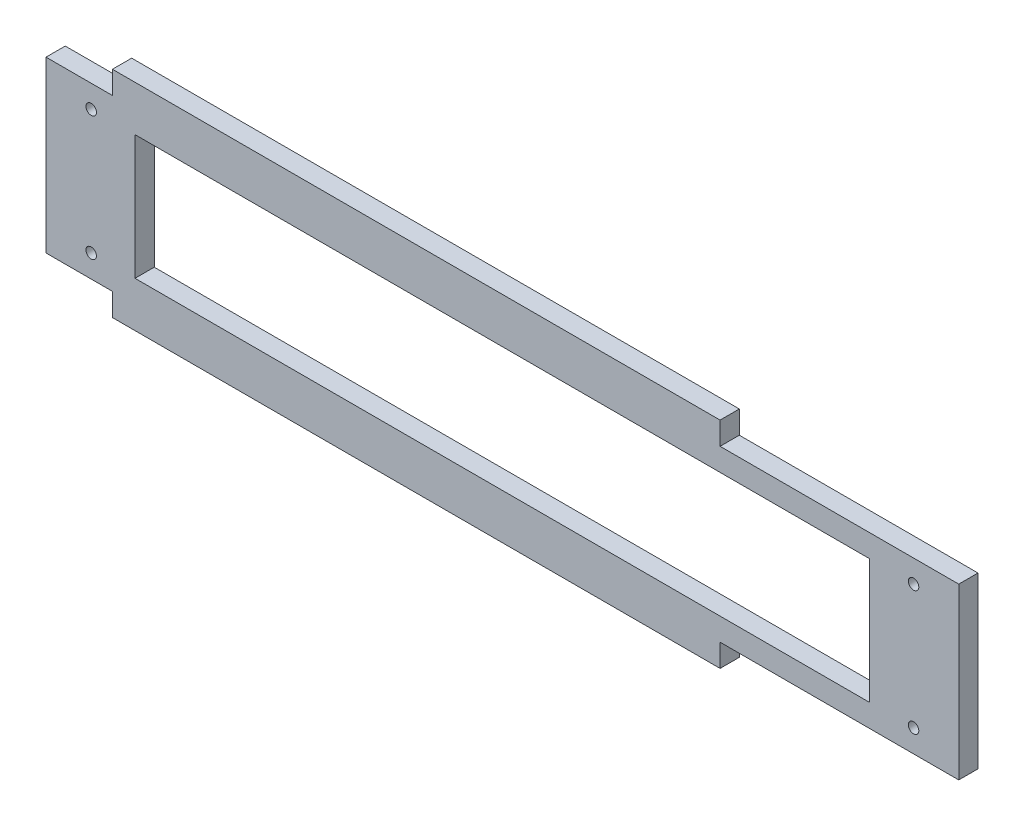
ISO-10303-21;
HEADER;
FILE_DESCRIPTION(('STEP AP214'),'2;1');
FILE_NAME('part.step','',(''),(''),'','','');
FILE_SCHEMA(('AUTOMOTIVE_DESIGN { 1 0 10303 214 1 1 1 1 }'));
ENDSEC;
DATA;
#1=APPLICATION_CONTEXT('core data for automotive mechanical design processes');
#2=APPLICATION_PROTOCOL_DEFINITION('international standard','automotive_design',2000,#1);
#3=PRODUCT_CONTEXT('',#1,'mechanical');
#4=PRODUCT('Part','Part','',(#3));
#5=PRODUCT_RELATED_PRODUCT_CATEGORY('part','',(#4));
#6=PRODUCT_DEFINITION_FORMATION('','',#4);
#7=PRODUCT_DEFINITION_CONTEXT('part definition',#1,'design');
#8=PRODUCT_DEFINITION('design','',#6,#7);
#9=PRODUCT_DEFINITION_SHAPE('','',#8);
#10=(LENGTH_UNIT() NAMED_UNIT(*) SI_UNIT(.MILLI.,.METRE.));
#11=(NAMED_UNIT(*) PLANE_ANGLE_UNIT() SI_UNIT($,.RADIAN.));
#12=(NAMED_UNIT(*) SI_UNIT($,.STERADIAN.) SOLID_ANGLE_UNIT());
#13=UNCERTAINTY_MEASURE_WITH_UNIT(LENGTH_MEASURE(1.E-05),#10,'distance_accuracy_value','');
#14=(GEOMETRIC_REPRESENTATION_CONTEXT(3) GLOBAL_UNCERTAINTY_ASSIGNED_CONTEXT((#13)) GLOBAL_UNIT_ASSIGNED_CONTEXT((#10,
#11,#12)) REPRESENTATION_CONTEXT('',''));
#15=CARTESIAN_POINT('',(0.,0.,0.));
#16=DIRECTION('',(0.,0.,1.));
#17=DIRECTION('',(1.,0.,0.));
#18=AXIS2_PLACEMENT_3D('',#15,#16,#17);
#19=CARTESIAN_POINT('',(-128.27,0.,5.4102));
#20=DIRECTION('',(-1.,0.,0.));
#21=DIRECTION('',(0.,0.,1.));
#22=AXIS2_PLACEMENT_3D('',#19,#20,#21);
#23=PLANE('',#22);
#24=DIRECTION('',(0.,1.,0.));
#25=VECTOR('',#24,1.);
#26=CARTESIAN_POINT('',(-128.27,0.,0.));
#27=LINE('',#26,#25);
#28=CARTESIAN_POINT('',(-128.27,-23.8379,0.));
#29=VERTEX_POINT('',#28);
#30=CARTESIAN_POINT('',(-128.27,23.8379,0.));
#31=VERTEX_POINT('',#30);
#32=EDGE_CURVE('E209',#29,#31,#27,.T.);
#33=ORIENTED_EDGE('',*,*,#32,.F.);
#34=DIRECTION('',(0.,0.,-1.));
#35=VECTOR('',#34,1.);
#36=CARTESIAN_POINT('',(-128.27,-23.8379,5.4102));
#37=LINE('',#36,#35);
#38=CARTESIAN_POINT('',(-128.27,-23.8379,5.4102));
#39=VERTEX_POINT('',#38);
#40=EDGE_CURVE('E11',#39,#29,#37,.T.);
#41=ORIENTED_EDGE('',*,*,#40,.F.);
#42=DIRECTION('',(0.,1.,0.));
#43=VECTOR('',#42,1.);
#44=CARTESIAN_POINT('',(-128.27,0.,5.4102));
#45=LINE('',#44,#43);
#46=CARTESIAN_POINT('',(-128.27,23.8379,5.4102));
#47=VERTEX_POINT('',#46);
#48=EDGE_CURVE('E384',#39,#47,#45,.T.);
#49=ORIENTED_EDGE('',*,*,#48,.T.);
#50=DIRECTION('',(0.,0.,-1.));
#51=VECTOR('',#50,1.);
#52=CARTESIAN_POINT('',(-128.27,23.8379,5.4102));
#53=LINE('',#52,#51);
#54=EDGE_CURVE('E112',#47,#31,#53,.T.);
#55=ORIENTED_EDGE('',*,*,#54,.T.);
#56=EDGE_LOOP('',(#33,#41,#49,#55));
#57=FACE_BOUND('',#56,.T.);
#58=ADVANCED_FACE('F35',(#57),#23,.T.);
#59=CARTESIAN_POINT('',(0.,-23.8379,5.4102));
#60=DIRECTION('',(0.,-1.,0.));
#61=DIRECTION('',(0.,0.,-1.));
#62=AXIS2_PLACEMENT_3D('',#59,#60,#61);
#63=PLANE('',#62);
#64=DIRECTION('',(-1.,0.,0.));
#65=VECTOR('',#64,1.);
#66=CARTESIAN_POINT('',(0.,-23.8379,0.));
#67=LINE('',#66,#65);
#68=CARTESIAN_POINT('',(-109.601,-23.8379,0.));
#69=VERTEX_POINT('',#68);
#70=EDGE_CURVE('E212',#69,#29,#67,.T.);
#71=ORIENTED_EDGE('',*,*,#70,.F.);
#72=DIRECTION('',(0.,0.,-1.));
#73=VECTOR('',#72,1.);
#74=CARTESIAN_POINT('',(-109.601,-23.8379,5.4102));
#75=LINE('',#74,#73);
#76=CARTESIAN_POINT('',(-109.601,-23.8379,5.4102));
#77=VERTEX_POINT('',#76);
#78=EDGE_CURVE('E45',#77,#69,#75,.T.);
#79=ORIENTED_EDGE('',*,*,#78,.F.);
#80=DIRECTION('',(-1.,0.,0.));
#81=VECTOR('',#80,1.);
#82=CARTESIAN_POINT('',(0.,-23.8379,5.4102));
#83=LINE('',#82,#81);
#84=EDGE_CURVE('E382',#77,#39,#83,.T.);
#85=ORIENTED_EDGE('',*,*,#84,.T.);
#86=ORIENTED_EDGE('',*,*,#40,.T.);
#87=EDGE_LOOP('',(#71,#79,#85,#86));
#88=FACE_BOUND('',#87,.T.);
#89=ADVANCED_FACE('F301',(#88),#63,.T.);
#90=CARTESIAN_POINT('',(-109.601,0.,5.4102));
#91=DIRECTION('',(-1.,0.,0.));
#92=DIRECTION('',(0.,0.,1.));
#93=AXIS2_PLACEMENT_3D('',#90,#91,#92);
#94=PLANE('',#93);
#95=DIRECTION('',(0.,1.,0.));
#96=VECTOR('',#95,1.);
#97=CARTESIAN_POINT('',(-109.601,0.,0.));
#98=LINE('',#97,#96);
#99=CARTESIAN_POINT('',(-109.601,-30.226,0.));
#100=VERTEX_POINT('',#99);
#101=EDGE_CURVE('E215',#100,#69,#98,.T.);
#102=ORIENTED_EDGE('',*,*,#101,.F.);
#103=DIRECTION('',(0.,0.,-1.));
#104=VECTOR('',#103,1.);
#105=CARTESIAN_POINT('',(-109.601,-30.226,5.4102));
#106=LINE('',#105,#104);
#107=CARTESIAN_POINT('',(-109.601,-30.226,5.4102));
#108=VERTEX_POINT('',#107);
#109=EDGE_CURVE('E264',#108,#100,#106,.T.);
#110=ORIENTED_EDGE('',*,*,#109,.F.);
#111=DIRECTION('',(0.,1.,0.));
#112=VECTOR('',#111,1.);
#113=CARTESIAN_POINT('',(-109.601,0.,5.4102));
#114=LINE('',#113,#112);
#115=EDGE_CURVE('E378',#108,#77,#114,.T.);
#116=ORIENTED_EDGE('',*,*,#115,.T.);
#117=ORIENTED_EDGE('',*,*,#78,.T.);
#118=EDGE_LOOP('',(#102,#110,#116,#117));
#119=FACE_BOUND('',#118,.T.);
#120=ADVANCED_FACE('F306',(#119),#94,.T.);
#121=CARTESIAN_POINT('',(0.,-30.226,5.4102));
#122=DIRECTION('',(0.,1.,0.));
#123=DIRECTION('',(0.,0.,1.));
#124=AXIS2_PLACEMENT_3D('',#121,#122,#123);
#125=PLANE('',#124);
#126=DIRECTION('',(1.,0.,0.));
#127=VECTOR('',#126,1.);
#128=CARTESIAN_POINT('',(0.,-30.226,0.));
#129=LINE('',#128,#127);
#130=CARTESIAN_POINT('',(61.191000046,-30.226,0.));
#131=VERTEX_POINT('',#130);
#132=EDGE_CURVE('E218',#100,#131,#129,.T.);
#133=ORIENTED_EDGE('',*,*,#132,.T.);
#134=DIRECTION('',(0.,0.,-1.));
#135=VECTOR('',#134,1.);
#136=CARTESIAN_POINT('',(61.191000046,-30.226,5.4102));
#137=LINE('',#136,#135);
#138=CARTESIAN_POINT('',(61.191000046,-30.226,5.4102));
#139=VERTEX_POINT('',#138);
#140=EDGE_CURVE('E261',#139,#131,#137,.T.);
#141=ORIENTED_EDGE('',*,*,#140,.F.);
#142=DIRECTION('',(1.,0.,0.));
#143=VECTOR('',#142,1.);
#144=CARTESIAN_POINT('',(0.,-30.226,5.4102));
#145=LINE('',#144,#143);
#146=EDGE_CURVE('E375',#108,#139,#145,.T.);
#147=ORIENTED_EDGE('',*,*,#146,.F.);
#148=ORIENTED_EDGE('',*,*,#109,.T.);
#149=EDGE_LOOP('',(#133,#141,#147,#148));
#150=FACE_BOUND('',#149,.T.);
#151=ADVANCED_FACE('F358',(#150),#125,.F.);
#152=CARTESIAN_POINT('',(61.191000046,0.,5.4102));
#153=DIRECTION('',(-1.,0.,0.));
#154=DIRECTION('',(0.,0.,1.));
#155=AXIS2_PLACEMENT_3D('',#152,#153,#154);
#156=PLANE('',#155);
#157=DIRECTION('',(0.,1.,0.));
#158=VECTOR('',#157,1.);
#159=CARTESIAN_POINT('',(61.191000046,0.,0.));
#160=LINE('',#159,#158);
#161=CARTESIAN_POINT('',(61.191000046,-23.8379,0.));
#162=VERTEX_POINT('',#161);
#163=EDGE_CURVE('E221',#131,#162,#160,.T.);
#164=ORIENTED_EDGE('',*,*,#163,.T.);
#165=DIRECTION('',(0.,0.,-1.));
#166=VECTOR('',#165,1.);
#167=CARTESIAN_POINT('',(61.191000046,-23.8379,5.4102));
#168=LINE('',#167,#166);
#169=CARTESIAN_POINT('',(61.191000046,-23.8379,5.4102));
#170=VERTEX_POINT('',#169);
#171=EDGE_CURVE('E259',#170,#162,#168,.T.);
#172=ORIENTED_EDGE('',*,*,#171,.F.);
#173=DIRECTION('',(0.,1.,0.));
#174=VECTOR('',#173,1.);
#175=CARTESIAN_POINT('',(61.191000046,0.,5.4102));
#176=LINE('',#175,#174);
#177=EDGE_CURVE('E377',#139,#170,#176,.T.);
#178=ORIENTED_EDGE('',*,*,#177,.F.);
#179=ORIENTED_EDGE('',*,*,#140,.T.);
#180=EDGE_LOOP('',(#164,#172,#178,#179));
#181=FACE_BOUND('',#180,.T.);
#182=ADVANCED_FACE('F354',(#181),#156,.F.);
#183=CARTESIAN_POINT('',(0.,-23.8379,5.4102));
#184=DIRECTION('',(0.,-1.,0.));
#185=DIRECTION('',(0.,0.,-1.));
#186=AXIS2_PLACEMENT_3D('',#183,#184,#185);
#187=PLANE('',#186);
#188=DIRECTION('',(-1.,0.,0.));
#189=VECTOR('',#188,1.);
#190=CARTESIAN_POINT('',(0.,-23.8379,0.));
#191=LINE('',#190,#189);
#192=CARTESIAN_POINT('',(128.27,-23.8379,0.));
#193=VERTEX_POINT('',#192);
#194=EDGE_CURVE('E224',#193,#162,#191,.T.);
#195=ORIENTED_EDGE('',*,*,#194,.F.);
#196=DIRECTION('',(0.,0.,-1.));
#197=VECTOR('',#196,1.);
#198=CARTESIAN_POINT('',(128.27,-23.8379,5.4102));
#199=LINE('',#198,#197);
#200=CARTESIAN_POINT('',(128.27,-23.8379,5.4102));
#201=VERTEX_POINT('',#200);
#202=EDGE_CURVE('E257',#201,#193,#199,.T.);
#203=ORIENTED_EDGE('',*,*,#202,.F.);
#204=DIRECTION('',(-1.,0.,0.));
#205=VECTOR('',#204,1.);
#206=CARTESIAN_POINT('',(0.,-23.8379,5.4102));
#207=LINE('',#206,#205);
#208=EDGE_CURVE('E389',#201,#170,#207,.T.);
#209=ORIENTED_EDGE('',*,*,#208,.T.);
#210=ORIENTED_EDGE('',*,*,#171,.T.);
#211=EDGE_LOOP('',(#195,#203,#209,#210));
#212=FACE_BOUND('',#211,.T.);
#213=ADVANCED_FACE('F350',(#212),#187,.T.);
#214=CARTESIAN_POINT('',(128.27,0.,5.4102));
#215=DIRECTION('',(-1.,0.,0.));
#216=DIRECTION('',(0.,0.,1.));
#217=AXIS2_PLACEMENT_3D('',#214,#215,#216);
#218=PLANE('',#217);
#219=DIRECTION('',(0.,1.,0.));
#220=VECTOR('',#219,1.);
#221=CARTESIAN_POINT('',(128.27,0.,0.));
#222=LINE('',#221,#220);
#223=CARTESIAN_POINT('',(128.27,23.8379,0.));
#224=VERTEX_POINT('',#223);
#225=EDGE_CURVE('E227',#193,#224,#222,.T.);
#226=ORIENTED_EDGE('',*,*,#225,.T.);
#227=DIRECTION('',(0.,0.,-1.));
#228=VECTOR('',#227,1.);
#229=CARTESIAN_POINT('',(128.27,23.8379,5.4102));
#230=LINE('',#229,#228);
#231=CARTESIAN_POINT('',(128.27,23.8379,5.4102));
#232=VERTEX_POINT('',#231);
#233=EDGE_CURVE('E254',#232,#224,#230,.T.);
#234=ORIENTED_EDGE('',*,*,#233,.F.);
#235=DIRECTION('',(0.,1.,0.));
#236=VECTOR('',#235,1.);
#237=CARTESIAN_POINT('',(128.27,0.,5.4102));
#238=LINE('',#237,#236);
#239=EDGE_CURVE('E392',#201,#232,#238,.T.);
#240=ORIENTED_EDGE('',*,*,#239,.F.);
#241=ORIENTED_EDGE('',*,*,#202,.T.);
#242=EDGE_LOOP('',(#226,#234,#240,#241));
#243=FACE_BOUND('',#242,.T.);
#244=ADVANCED_FACE('F346',(#243),#218,.F.);
#245=CARTESIAN_POINT('',(0.,23.8379,5.4102));
#246=DIRECTION('',(0.,-1.,0.));
#247=DIRECTION('',(0.,0.,-1.));
#248=AXIS2_PLACEMENT_3D('',#245,#246,#247);
#249=PLANE('',#248);
#250=DIRECTION('',(-1.,0.,0.));
#251=VECTOR('',#250,1.);
#252=CARTESIAN_POINT('',(0.,23.8379,0.));
#253=LINE('',#252,#251);
#254=CARTESIAN_POINT('',(61.191000046,23.8379,0.));
#255=VERTEX_POINT('',#254);
#256=EDGE_CURVE('E230',#224,#255,#253,.T.);
#257=ORIENTED_EDGE('',*,*,#256,.T.);
#258=DIRECTION('',(0.,0.,-1.));
#259=VECTOR('',#258,1.);
#260=CARTESIAN_POINT('',(61.191000046,23.8379,5.4102));
#261=LINE('',#260,#259);
#262=CARTESIAN_POINT('',(61.191000046,23.8379,5.4102));
#263=VERTEX_POINT('',#262);
#264=EDGE_CURVE('E251',#263,#255,#261,.T.);
#265=ORIENTED_EDGE('',*,*,#264,.F.);
#266=DIRECTION('',(-1.,0.,0.));
#267=VECTOR('',#266,1.);
#268=CARTESIAN_POINT('',(0.,23.8379,5.4102));
#269=LINE('',#268,#267);
#270=EDGE_CURVE('E395',#232,#263,#269,.T.);
#271=ORIENTED_EDGE('',*,*,#270,.F.);
#272=ORIENTED_EDGE('',*,*,#233,.T.);
#273=EDGE_LOOP('',(#257,#265,#271,#272));
#274=FACE_BOUND('',#273,.T.);
#275=ADVANCED_FACE('F342',(#274),#249,.F.);
#276=CARTESIAN_POINT('',(61.191000046,0.,5.4102));
#277=DIRECTION('',(-1.,0.,0.));
#278=DIRECTION('',(0.,0.,1.));
#279=AXIS2_PLACEMENT_3D('',#276,#277,#278);
#280=PLANE('',#279);
#281=DIRECTION('',(0.,1.,0.));
#282=VECTOR('',#281,1.);
#283=CARTESIAN_POINT('',(61.191000046,0.,0.));
#284=LINE('',#283,#282);
#285=CARTESIAN_POINT('',(61.191000046,30.226,0.));
#286=VERTEX_POINT('',#285);
#287=EDGE_CURVE('E233',#255,#286,#284,.T.);
#288=ORIENTED_EDGE('',*,*,#287,.T.);
#289=DIRECTION('',(0.,0.,-1.));
#290=VECTOR('',#289,1.);
#291=CARTESIAN_POINT('',(61.191000046,30.226,5.4102));
#292=LINE('',#291,#290);
#293=CARTESIAN_POINT('',(61.191000046,30.226,5.4102));
#294=VERTEX_POINT('',#293);
#295=EDGE_CURVE('E170',#294,#286,#292,.T.);
#296=ORIENTED_EDGE('',*,*,#295,.F.);
#297=DIRECTION('',(0.,1.,0.));
#298=VECTOR('',#297,1.);
#299=CARTESIAN_POINT('',(61.191000046,0.,5.4102));
#300=LINE('',#299,#298);
#301=EDGE_CURVE('E176',#263,#294,#300,.T.);
#302=ORIENTED_EDGE('',*,*,#301,.F.);
#303=ORIENTED_EDGE('',*,*,#264,.T.);
#304=EDGE_LOOP('',(#288,#296,#302,#303));
#305=FACE_BOUND('',#304,.T.);
#306=ADVANCED_FACE('F339',(#305),#280,.F.);
#307=CARTESIAN_POINT('',(0.,30.226,5.4102));
#308=DIRECTION('',(0.,1.,0.));
#309=DIRECTION('',(0.,0.,1.));
#310=AXIS2_PLACEMENT_3D('',#307,#308,#309);
#311=PLANE('',#310);
#312=DIRECTION('',(1.,0.,0.));
#313=VECTOR('',#312,1.);
#314=CARTESIAN_POINT('',(0.,30.226,0.));
#315=LINE('',#314,#313);
#316=CARTESIAN_POINT('',(-109.601,30.226,0.));
#317=VERTEX_POINT('',#316);
#318=EDGE_CURVE('E165',#317,#286,#315,.T.);
#319=ORIENTED_EDGE('',*,*,#318,.F.);
#320=DIRECTION('',(0.,0.,-1.));
#321=VECTOR('',#320,1.);
#322=CARTESIAN_POINT('',(-109.601,30.226,5.4102));
#323=LINE('',#322,#321);
#324=CARTESIAN_POINT('',(-109.601,30.226,5.4102));
#325=VERTEX_POINT('',#324);
#326=EDGE_CURVE('E160',#325,#317,#323,.T.);
#327=ORIENTED_EDGE('',*,*,#326,.F.);
#328=DIRECTION('',(1.,0.,0.));
#329=VECTOR('',#328,1.);
#330=CARTESIAN_POINT('',(0.,30.226,5.4102));
#331=LINE('',#330,#329);
#332=EDGE_CURVE('E163',#325,#294,#331,.T.);
#333=ORIENTED_EDGE('',*,*,#332,.T.);
#334=ORIENTED_EDGE('',*,*,#295,.T.);
#335=EDGE_LOOP('',(#319,#327,#333,#334));
#336=FACE_BOUND('',#335,.T.);
#337=ADVANCED_FACE('F162',(#336),#311,.T.);
#338=CARTESIAN_POINT('',(-109.601,0.,5.4102));
#339=DIRECTION('',(-1.,0.,0.));
#340=DIRECTION('',(0.,0.,1.));
#341=AXIS2_PLACEMENT_3D('',#338,#339,#340);
#342=PLANE('',#341);
#343=DIRECTION('',(0.,1.,0.));
#344=VECTOR('',#343,1.);
#345=CARTESIAN_POINT('',(-109.601,0.,0.));
#346=LINE('',#345,#344);
#347=CARTESIAN_POINT('',(-109.601,23.8379,0.));
#348=VERTEX_POINT('',#347);
#349=EDGE_CURVE('E237',#348,#317,#346,.T.);
#350=ORIENTED_EDGE('',*,*,#349,.F.);
#351=DIRECTION('',(0.,0.,-1.));
#352=VECTOR('',#351,1.);
#353=CARTESIAN_POINT('',(-109.601,23.8379,5.4102));
#354=LINE('',#353,#352);
#355=CARTESIAN_POINT('',(-109.601,23.8379,5.4102));
#356=VERTEX_POINT('',#355);
#357=EDGE_CURVE('E105',#356,#348,#354,.T.);
#358=ORIENTED_EDGE('',*,*,#357,.F.);
#359=DIRECTION('',(0.,1.,0.));
#360=VECTOR('',#359,1.);
#361=CARTESIAN_POINT('',(-109.601,0.,5.4102));
#362=LINE('',#361,#360);
#363=EDGE_CURVE('E174',#356,#325,#362,.T.);
#364=ORIENTED_EDGE('',*,*,#363,.T.);
#365=ORIENTED_EDGE('',*,*,#326,.T.);
#366=EDGE_LOOP('',(#350,#358,#364,#365));
#367=FACE_BOUND('',#366,.T.);
#368=ADVANCED_FACE('F179',(#367),#342,.T.);
#369=CARTESIAN_POINT('',(0.,17.4879,5.4102));
#370=DIRECTION('',(0.,1.,0.));
#371=DIRECTION('',(0.,0.,1.));
#372=AXIS2_PLACEMENT_3D('',#369,#370,#371);
#373=PLANE('',#372);
#374=DIRECTION('',(1.,0.,0.));
#375=VECTOR('',#374,1.);
#376=CARTESIAN_POINT('',(0.,17.4879,0.));
#377=LINE('',#376,#375);
#378=CARTESIAN_POINT('',(-103.251,17.4879,0.));
#379=VERTEX_POINT('',#378);
#380=CARTESIAN_POINT('',(103.251,17.4879,0.));
#381=VERTEX_POINT('',#380);
#382=EDGE_CURVE('E191',#379,#381,#377,.T.);
#383=ORIENTED_EDGE('',*,*,#382,.T.);
#384=DIRECTION('',(0.,0.,-1.));
#385=VECTOR('',#384,1.);
#386=CARTESIAN_POINT('',(103.251,17.4879,5.4102));
#387=LINE('',#386,#385);
#388=CARTESIAN_POINT('',(103.251,17.4879,5.4102));
#389=VERTEX_POINT('',#388);
#390=EDGE_CURVE('E39',#389,#381,#387,.T.);
#391=ORIENTED_EDGE('',*,*,#390,.F.);
#392=DIRECTION('',(1.,0.,0.));
#393=VECTOR('',#392,1.);
#394=CARTESIAN_POINT('',(0.,17.4879,5.4102));
#395=LINE('',#394,#393);
#396=CARTESIAN_POINT('',(-103.251,17.4879,5.4102));
#397=VERTEX_POINT('',#396);
#398=EDGE_CURVE('E247',#397,#389,#395,.T.);
#399=ORIENTED_EDGE('',*,*,#398,.F.);
#400=DIRECTION('',(0.,0.,-1.));
#401=VECTOR('',#400,1.);
#402=CARTESIAN_POINT('',(-103.251,17.4879,5.4102));
#403=LINE('',#402,#401);
#404=EDGE_CURVE('E190',#397,#379,#403,.T.);
#405=ORIENTED_EDGE('',*,*,#404,.T.);
#406=EDGE_LOOP('',(#383,#391,#399,#405));
#407=FACE_BOUND('',#406,.T.);
#408=ADVANCED_FACE('F37',(#407),#373,.F.);
#409=CARTESIAN_POINT('',(103.251,0.,5.4102));
#410=DIRECTION('',(1.,0.,0.));
#411=DIRECTION('',(0.,0.,-1.));
#412=AXIS2_PLACEMENT_3D('',#409,#410,#411);
#413=PLANE('',#412);
#414=DIRECTION('',(0.,-1.,0.));
#415=VECTOR('',#414,1.);
#416=CARTESIAN_POINT('',(103.251,0.,0.));
#417=LINE('',#416,#415);
#418=CARTESIAN_POINT('',(103.251,-17.4879,0.));
#419=VERTEX_POINT('',#418);
#420=EDGE_CURVE('E194',#381,#419,#417,.T.);
#421=ORIENTED_EDGE('',*,*,#420,.T.);
#422=DIRECTION('',(0.,0.,-1.));
#423=VECTOR('',#422,1.);
#424=CARTESIAN_POINT('',(103.251,-17.4879,5.4102));
#425=LINE('',#424,#423);
#426=CARTESIAN_POINT('',(103.251,-17.4879,5.4102));
#427=VERTEX_POINT('',#426);
#428=EDGE_CURVE('E269',#427,#419,#425,.T.);
#429=ORIENTED_EDGE('',*,*,#428,.F.);
#430=DIRECTION('',(0.,-1.,0.));
#431=VECTOR('',#430,1.);
#432=CARTESIAN_POINT('',(103.251,0.,5.4102));
#433=LINE('',#432,#431);
#434=EDGE_CURVE('E120',#389,#427,#433,.T.);
#435=ORIENTED_EDGE('',*,*,#434,.F.);
#436=ORIENTED_EDGE('',*,*,#390,.T.);
#437=EDGE_LOOP('',(#421,#429,#435,#436));
#438=FACE_BOUND('',#437,.T.);
#439=ADVANCED_FACE('F274',(#438),#413,.F.);
#440=CARTESIAN_POINT('',(0.,-17.4879,5.4102));
#441=DIRECTION('',(0.,1.,0.));
#442=DIRECTION('',(0.,0.,1.));
#443=AXIS2_PLACEMENT_3D('',#440,#441,#442);
#444=PLANE('',#443);
#445=DIRECTION('',(1.,0.,0.));
#446=VECTOR('',#445,1.);
#447=CARTESIAN_POINT('',(0.,-17.4879,0.));
#448=LINE('',#447,#446);
#449=CARTESIAN_POINT('',(-103.251,-17.4879,0.));
#450=VERTEX_POINT('',#449);
#451=EDGE_CURVE('E197',#450,#419,#448,.T.);
#452=ORIENTED_EDGE('',*,*,#451,.F.);
#453=DIRECTION('',(0.,0.,-1.));
#454=VECTOR('',#453,1.);
#455=CARTESIAN_POINT('',(-103.251,-17.4879,5.4102));
#456=LINE('',#455,#454);
#457=CARTESIAN_POINT('',(-103.251,-17.4879,5.4102));
#458=VERTEX_POINT('',#457);
#459=EDGE_CURVE('E268',#458,#450,#456,.T.);
#460=ORIENTED_EDGE('',*,*,#459,.F.);
#461=DIRECTION('',(1.,0.,0.));
#462=VECTOR('',#461,1.);
#463=CARTESIAN_POINT('',(0.,-17.4879,5.4102));
#464=LINE('',#463,#462);
#465=EDGE_CURVE('E408',#458,#427,#464,.T.);
#466=ORIENTED_EDGE('',*,*,#465,.T.);
#467=ORIENTED_EDGE('',*,*,#428,.T.);
#468=EDGE_LOOP('',(#452,#460,#466,#467));
#469=FACE_BOUND('',#468,.T.);
#470=ADVANCED_FACE('F288',(#469),#444,.T.);
#471=CARTESIAN_POINT('',(115.57,-17.4879,5.4102));
#472=DIRECTION('',(0.,0.,-1.));
#473=DIRECTION('',(-1.,0.,0.));
#474=AXIS2_PLACEMENT_3D('',#471,#472,#473);
#475=CYLINDRICAL_SURFACE('',#474,1.47320000000001);
#476=CARTESIAN_POINT('',(115.57,-17.4879,5.4102));
#477=DIRECTION('',(0.,0.,1.));
#478=DIRECTION('',(1.,0.,0.));
#479=AXIS2_PLACEMENT_3D('',#476,#477,#478);
#480=CIRCLE('',#479,1.47320000000001);
#481=CARTESIAN_POINT('',(117.0432,-17.4879,5.4102));
#482=VERTEX_POINT('',#481);
#483=EDGE_CURVE('E181',#482,#482,#480,.T.);
#484=ORIENTED_EDGE('',*,*,#483,.T.);
#485=EDGE_LOOP('',(#484));
#486=FACE_BOUND('',#485,.T.);
#487=CARTESIAN_POINT('',(115.57,-17.4879,0.));
#488=DIRECTION('',(0.,0.,1.));
#489=DIRECTION('',(1.,0.,0.));
#490=AXIS2_PLACEMENT_3D('',#487,#488,#489);
#491=CIRCLE('',#490,1.47320000000001);
#492=CARTESIAN_POINT('',(117.0432,-17.4879,0.));
#493=VERTEX_POINT('',#492);
#494=EDGE_CURVE('E241',#493,#493,#491,.T.);
#495=ORIENTED_EDGE('',*,*,#494,.F.);
#496=EDGE_LOOP('',(#495));
#497=FACE_BOUND('',#496,.T.);
#498=ADVANCED_FACE('F290',(#486,#497),#475,.F.);
#499=CARTESIAN_POINT('',(0.,23.8379,5.4102));
#500=DIRECTION('',(0.,-1.,0.));
#501=DIRECTION('',(0.,0.,-1.));
#502=AXIS2_PLACEMENT_3D('',#499,#500,#501);
#503=PLANE('',#502);
#504=DIRECTION('',(-1.,0.,0.));
#505=VECTOR('',#504,1.);
#506=CARTESIAN_POINT('',(0.,23.8379,0.));
#507=LINE('',#506,#505);
#508=EDGE_CURVE('E239',#348,#31,#507,.T.);
#509=ORIENTED_EDGE('',*,*,#508,.T.);
#510=ORIENTED_EDGE('',*,*,#54,.F.);
#511=DIRECTION('',(-1.,0.,0.));
#512=VECTOR('',#511,1.);
#513=CARTESIAN_POINT('',(0.,23.8379,5.4102));
#514=LINE('',#513,#512);
#515=EDGE_CURVE('E54',#356,#47,#514,.T.);
#516=ORIENTED_EDGE('',*,*,#515,.F.);
#517=ORIENTED_EDGE('',*,*,#357,.T.);
#518=EDGE_LOOP('',(#509,#510,#516,#517));
#519=FACE_BOUND('',#518,.T.);
#520=ADVANCED_FACE('F296',(#519),#503,.F.);
#521=CARTESIAN_POINT('',(-115.57,17.4879,5.4102));
#522=DIRECTION('',(0.,0.,-1.));
#523=DIRECTION('',(-1.,0.,0.));
#524=AXIS2_PLACEMENT_3D('',#521,#522,#523);
#525=CYLINDRICAL_SURFACE('',#524,1.4732);
#526=CARTESIAN_POINT('',(-115.57,17.4879,5.4102));
#527=DIRECTION('',(0.,0.,1.));
#528=DIRECTION('',(1.,0.,0.));
#529=AXIS2_PLACEMENT_3D('',#526,#527,#528);
#530=CIRCLE('',#529,1.4732);
#531=CARTESIAN_POINT('',(-114.0968,17.4879,5.4102));
#532=VERTEX_POINT('',#531);
#533=EDGE_CURVE('E400',#532,#532,#530,.T.);
#534=ORIENTED_EDGE('',*,*,#533,.T.);
#535=EDGE_LOOP('',(#534));
#536=FACE_BOUND('',#535,.T.);
#537=CARTESIAN_POINT('',(-115.57,17.4879,0.));
#538=DIRECTION('',(0.,0.,1.));
#539=DIRECTION('',(1.,0.,0.));
#540=AXIS2_PLACEMENT_3D('',#537,#538,#539);
#541=CIRCLE('',#540,1.4732);
#542=CARTESIAN_POINT('',(-114.0968,17.4879,0.));
#543=VERTEX_POINT('',#542);
#544=EDGE_CURVE('E206',#543,#543,#541,.T.);
#545=ORIENTED_EDGE('',*,*,#544,.F.);
#546=EDGE_LOOP('',(#545));
#547=FACE_BOUND('',#546,.T.);
#548=ADVANCED_FACE('F311',(#536,#547),#525,.F.);
#549=CARTESIAN_POINT('',(-115.57,-17.4879,5.4102));
#550=DIRECTION('',(0.,0.,-1.));
#551=DIRECTION('',(-1.,0.,0.));
#552=AXIS2_PLACEMENT_3D('',#549,#550,#551);
#553=CYLINDRICAL_SURFACE('',#552,1.47320000000001);
#554=CARTESIAN_POINT('',(-115.57,-17.4879,5.4102));
#555=DIRECTION('',(0.,0.,1.));
#556=DIRECTION('',(1.,0.,0.));
#557=AXIS2_PLACEMENT_3D('',#554,#555,#556);
#558=CIRCLE('',#557,1.47320000000001);
#559=CARTESIAN_POINT('',(-114.0968,-17.4879,5.4102));
#560=VERTEX_POINT('',#559);
#561=EDGE_CURVE('E402',#560,#560,#558,.T.);
#562=ORIENTED_EDGE('',*,*,#561,.T.);
#563=EDGE_LOOP('',(#562));
#564=FACE_BOUND('',#563,.T.);
#565=CARTESIAN_POINT('',(-115.57,-17.4879,0.));
#566=DIRECTION('',(0.,0.,1.));
#567=DIRECTION('',(1.,0.,0.));
#568=AXIS2_PLACEMENT_3D('',#565,#566,#567);
#569=CIRCLE('',#568,1.47320000000001);
#570=CARTESIAN_POINT('',(-114.0968,-17.4879,0.));
#571=VERTEX_POINT('',#570);
#572=EDGE_CURVE('E203',#571,#571,#569,.T.);
#573=ORIENTED_EDGE('',*,*,#572,.F.);
#574=EDGE_LOOP('',(#573));
#575=FACE_BOUND('',#574,.T.);
#576=ADVANCED_FACE('F314',(#564,#575),#553,.F.);
#577=CARTESIAN_POINT('',(-103.251,0.,5.4102));
#578=DIRECTION('',(1.,0.,0.));
#579=DIRECTION('',(0.,0.,-1.));
#580=AXIS2_PLACEMENT_3D('',#577,#578,#579);
#581=PLANE('',#580);
#582=DIRECTION('',(0.,-1.,0.));
#583=VECTOR('',#582,1.);
#584=CARTESIAN_POINT('',(-103.251,0.,0.));
#585=LINE('',#584,#583);
#586=EDGE_CURVE('E200',#379,#450,#585,.T.);
#587=ORIENTED_EDGE('',*,*,#586,.F.);
#588=ORIENTED_EDGE('',*,*,#404,.F.);
#589=DIRECTION('',(0.,-1.,0.));
#590=VECTOR('',#589,1.);
#591=CARTESIAN_POINT('',(-103.251,0.,5.4102));
#592=LINE('',#591,#590);
#593=EDGE_CURVE('E286',#397,#458,#592,.T.);
#594=ORIENTED_EDGE('',*,*,#593,.T.);
#595=ORIENTED_EDGE('',*,*,#459,.T.);
#596=EDGE_LOOP('',(#587,#588,#594,#595));
#597=FACE_BOUND('',#596,.T.);
#598=ADVANCED_FACE('F283',(#597),#581,.T.);
#599=CARTESIAN_POINT('',(115.57,17.4879,5.4102));
#600=DIRECTION('',(0.,0.,-1.));
#601=DIRECTION('',(-1.,0.,0.));
#602=AXIS2_PLACEMENT_3D('',#599,#600,#601);
#603=CYLINDRICAL_SURFACE('',#602,1.4732);
#604=CARTESIAN_POINT('',(115.57,17.4879,5.4102));
#605=DIRECTION('',(0.,0.,1.));
#606=DIRECTION('',(1.,0.,0.));
#607=AXIS2_PLACEMENT_3D('',#604,#605,#606);
#608=CIRCLE('',#607,1.4732);
#609=CARTESIAN_POINT('',(117.0432,17.4879,5.4102));
#610=VERTEX_POINT('',#609);
#611=EDGE_CURVE('E187',#610,#610,#608,.T.);
#612=ORIENTED_EDGE('',*,*,#611,.T.);
#613=EDGE_LOOP('',(#612));
#614=FACE_BOUND('',#613,.T.);
#615=CARTESIAN_POINT('',(115.57,17.4879,0.));
#616=DIRECTION('',(0.,0.,1.));
#617=DIRECTION('',(1.,0.,0.));
#618=AXIS2_PLACEMENT_3D('',#615,#616,#617);
#619=CIRCLE('',#618,1.4732);
#620=CARTESIAN_POINT('',(117.0432,17.4879,0.));
#621=VERTEX_POINT('',#620);
#622=EDGE_CURVE('E244',#621,#621,#619,.T.);
#623=ORIENTED_EDGE('',*,*,#622,.F.);
#624=EDGE_LOOP('',(#623));
#625=FACE_BOUND('',#624,.T.);
#626=ADVANCED_FACE('F319',(#614,#625),#603,.F.);
#627=CARTESIAN_POINT('',(0.,0.,5.4102));
#628=DIRECTION('',(0.,0.,1.));
#629=DIRECTION('',(1.,0.,0.));
#630=AXIS2_PLACEMENT_3D('',#627,#628,#629);
#631=PLANE('',#630);
#632=ORIENTED_EDGE('',*,*,#398,.T.);
#633=ORIENTED_EDGE('',*,*,#434,.T.);
#634=ORIENTED_EDGE('',*,*,#465,.F.);
#635=ORIENTED_EDGE('',*,*,#593,.F.);
#636=EDGE_LOOP('',(#632,#633,#634,#635));
#637=FACE_BOUND('',#636,.T.);
#638=ORIENTED_EDGE('',*,*,#561,.F.);
#639=EDGE_LOOP('',(#638));
#640=FACE_BOUND('',#639,.T.);
#641=ORIENTED_EDGE('',*,*,#533,.F.);
#642=EDGE_LOOP('',(#641));
#643=FACE_BOUND('',#642,.T.);
#644=ORIENTED_EDGE('',*,*,#48,.F.);
#645=ORIENTED_EDGE('',*,*,#84,.F.);
#646=ORIENTED_EDGE('',*,*,#115,.F.);
#647=ORIENTED_EDGE('',*,*,#146,.T.);
#648=ORIENTED_EDGE('',*,*,#177,.T.);
#649=ORIENTED_EDGE('',*,*,#208,.F.);
#650=ORIENTED_EDGE('',*,*,#239,.T.);
#651=ORIENTED_EDGE('',*,*,#270,.T.);
#652=ORIENTED_EDGE('',*,*,#301,.T.);
#653=ORIENTED_EDGE('',*,*,#332,.F.);
#654=ORIENTED_EDGE('',*,*,#363,.F.);
#655=ORIENTED_EDGE('',*,*,#515,.T.);
#656=EDGE_LOOP('',(#644,#645,#646,#647,#648,#649,#650,#651,#652,#653,#654,#655));
#657=FACE_BOUND('',#656,.T.);
#658=ORIENTED_EDGE('',*,*,#483,.F.);
#659=EDGE_LOOP('',(#658));
#660=FACE_BOUND('',#659,.T.);
#661=ORIENTED_EDGE('',*,*,#611,.F.);
#662=EDGE_LOOP('',(#661));
#663=FACE_BOUND('',#662,.T.);
#664=ADVANCED_FACE('F172',(#637,#640,#643,#657,#660,#663),#631,.T.);
#665=CARTESIAN_POINT('',(0.,0.,0.));
#666=DIRECTION('',(0.,0.,1.));
#667=DIRECTION('',(1.,0.,0.));
#668=AXIS2_PLACEMENT_3D('',#665,#666,#667);
#669=PLANE('',#668);
#670=ORIENTED_EDGE('',*,*,#382,.F.);
#671=ORIENTED_EDGE('',*,*,#586,.T.);
#672=ORIENTED_EDGE('',*,*,#451,.T.);
#673=ORIENTED_EDGE('',*,*,#420,.F.);
#674=EDGE_LOOP('',(#670,#671,#672,#673));
#675=FACE_BOUND('',#674,.T.);
#676=ORIENTED_EDGE('',*,*,#572,.T.);
#677=EDGE_LOOP('',(#676));
#678=FACE_BOUND('',#677,.T.);
#679=ORIENTED_EDGE('',*,*,#544,.T.);
#680=EDGE_LOOP('',(#679));
#681=FACE_BOUND('',#680,.T.);
#682=ORIENTED_EDGE('',*,*,#32,.T.);
#683=ORIENTED_EDGE('',*,*,#508,.F.);
#684=ORIENTED_EDGE('',*,*,#349,.T.);
#685=ORIENTED_EDGE('',*,*,#318,.T.);
#686=ORIENTED_EDGE('',*,*,#287,.F.);
#687=ORIENTED_EDGE('',*,*,#256,.F.);
#688=ORIENTED_EDGE('',*,*,#225,.F.);
#689=ORIENTED_EDGE('',*,*,#194,.T.);
#690=ORIENTED_EDGE('',*,*,#163,.F.);
#691=ORIENTED_EDGE('',*,*,#132,.F.);
#692=ORIENTED_EDGE('',*,*,#101,.T.);
#693=ORIENTED_EDGE('',*,*,#70,.T.);
#694=EDGE_LOOP('',(#682,#683,#684,#685,#686,#687,#688,#689,#690,#691,#692,#693));
#695=FACE_BOUND('',#694,.T.);
#696=ORIENTED_EDGE('',*,*,#494,.T.);
#697=EDGE_LOOP('',(#696));
#698=FACE_BOUND('',#697,.T.);
#699=ORIENTED_EDGE('',*,*,#622,.T.);
#700=EDGE_LOOP('',(#699));
#701=FACE_BOUND('',#700,.T.);
#702=ADVANCED_FACE('F280',(#675,#678,#681,#695,#698,#701),#669,.F.);
#703=CLOSED_SHELL('',(#58,#89,#120,#151,#182,#213,#244,#275,#306,#337,#368,#408,#439,#470,#498,
#520,#548,#576,#598,#626,#664,#702));
#704=MANIFOLD_SOLID_BREP('B2',#703);
#705=ADVANCED_BREP_SHAPE_REPRESENTATION('',(#18,#704),#14);
#706=SHAPE_DEFINITION_REPRESENTATION(#9,#705);
ENDSEC;
END-ISO-10303-21;
